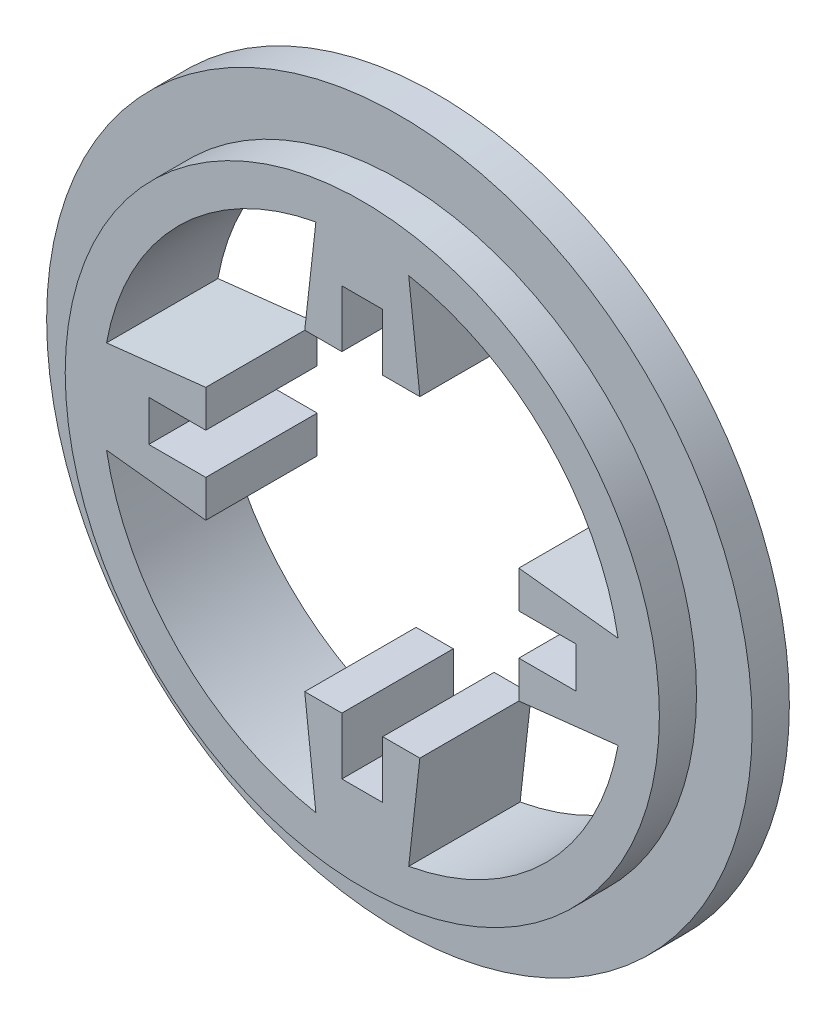
ISO-10303-21;
HEADER;
FILE_DESCRIPTION(('STEP AP214'),'2;1');
FILE_NAME('part.step','',(''),(''),'','','');
FILE_SCHEMA(('AUTOMOTIVE_DESIGN { 1 0 10303 214 1 1 1 1 }'));
ENDSEC;
DATA;
#1=APPLICATION_CONTEXT('core data for automotive mechanical design processes');
#2=APPLICATION_PROTOCOL_DEFINITION('international standard','automotive_design',2000,#1);
#3=PRODUCT_CONTEXT('',#1,'mechanical');
#4=PRODUCT('Part','Part','',(#3));
#5=PRODUCT_RELATED_PRODUCT_CATEGORY('part','',(#4));
#6=PRODUCT_DEFINITION_FORMATION('','',#4);
#7=PRODUCT_DEFINITION_CONTEXT('part definition',#1,'design');
#8=PRODUCT_DEFINITION('design','',#6,#7);
#9=PRODUCT_DEFINITION_SHAPE('','',#8);
#10=(LENGTH_UNIT() NAMED_UNIT(*) SI_UNIT(.MILLI.,.METRE.));
#11=(NAMED_UNIT(*) PLANE_ANGLE_UNIT() SI_UNIT($,.RADIAN.));
#12=(NAMED_UNIT(*) SI_UNIT($,.STERADIAN.) SOLID_ANGLE_UNIT());
#13=UNCERTAINTY_MEASURE_WITH_UNIT(LENGTH_MEASURE(1.E-05),#10,'distance_accuracy_value','');
#14=(GEOMETRIC_REPRESENTATION_CONTEXT(3) GLOBAL_UNCERTAINTY_ASSIGNED_CONTEXT((#13)) GLOBAL_UNIT_ASSIGNED_CONTEXT((#10,
#11,#12)) REPRESENTATION_CONTEXT('',''));
#15=CARTESIAN_POINT('',(0.,0.,0.));
#16=DIRECTION('',(0.,0.,1.));
#17=DIRECTION('',(1.,0.,0.));
#18=AXIS2_PLACEMENT_3D('',#15,#16,#17);
#19=CARTESIAN_POINT('',(-2.5,13.7749773139559,4.));
#20=DIRECTION('',(0.993761759972197,-0.111523828919929,0.));
#21=DIRECTION('',(0.111523828919929,0.993761759972197,0.));
#22=AXIS2_PLACEMENT_3D('',#19,#20,#21);
#23=PLANE('',#22);
#24=DIRECTION('',(-0.111523828919929,-0.993761759972197,0.));
#25=VECTOR('',#24,1.);
#26=CARTESIAN_POINT('',(-2.5,13.7749773139559,-2.));
#27=LINE('',#26,#25);
#28=CARTESIAN_POINT('',(-2.5,13.7749773139559,-2.));
#29=VERTEX_POINT('',#28);
#30=CARTESIAN_POINT('',(-3.1,8.42852300228219,-2.));
#31=VERTEX_POINT('',#30);
#32=EDGE_CURVE('E137',#29,#31,#27,.T.);
#33=ORIENTED_EDGE('',*,*,#32,.T.);
#34=DIRECTION('',(0.,0.,-1.));
#35=VECTOR('',#34,1.);
#36=CARTESIAN_POINT('',(-3.1,8.42852300228219,4.));
#37=LINE('',#36,#35);
#38=CARTESIAN_POINT('',(-3.1,8.42852300228219,4.));
#39=VERTEX_POINT('',#38);
#40=EDGE_CURVE('E51',#39,#31,#37,.T.);
#41=ORIENTED_EDGE('',*,*,#40,.F.);
#42=DIRECTION('',(-0.111523828919929,-0.993761759972197,0.));
#43=VECTOR('',#42,1.);
#44=CARTESIAN_POINT('',(-2.5,13.7749773139559,4.));
#45=LINE('',#44,#43);
#46=CARTESIAN_POINT('',(-2.5,13.7749773139559,4.));
#47=VERTEX_POINT('',#46);
#48=EDGE_CURVE('E101',#47,#39,#45,.T.);
#49=ORIENTED_EDGE('',*,*,#48,.F.);
#50=DIRECTION('',(0.,0.,-1.));
#51=VECTOR('',#50,1.);
#52=CARTESIAN_POINT('',(-2.5,13.7749773139559,4.));
#53=LINE('',#52,#51);
#54=EDGE_CURVE('E11',#47,#29,#53,.T.);
#55=ORIENTED_EDGE('',*,*,#54,.T.);
#56=EDGE_LOOP('',(#33,#41,#49,#55));
#57=FACE_BOUND('',#56,.T.);
#58=ADVANCED_FACE('F43',(#57),#23,.F.);
#59=CARTESIAN_POINT('',(-3.1,8.42852300228219,4.));
#60=DIRECTION('',(0.,1.,0.));
#61=DIRECTION('',(0.,0.,1.));
#62=AXIS2_PLACEMENT_3D('',#59,#60,#61);
#63=PLANE('',#62);
#64=DIRECTION('',(1.,0.,0.));
#65=VECTOR('',#64,1.);
#66=CARTESIAN_POINT('',(-3.1,8.42852300228219,-2.));
#67=LINE('',#66,#65);
#68=CARTESIAN_POINT('',(-1.1,8.42852300228219,-2.));
#69=VERTEX_POINT('',#68);
#70=EDGE_CURVE('E139',#31,#69,#67,.T.);
#71=ORIENTED_EDGE('',*,*,#70,.T.);
#72=DIRECTION('',(0.,0.,-1.));
#73=VECTOR('',#72,1.);
#74=CARTESIAN_POINT('',(-1.1,8.42852300228219,4.));
#75=LINE('',#74,#73);
#76=CARTESIAN_POINT('',(-1.1,8.42852300228219,4.));
#77=VERTEX_POINT('',#76);
#78=EDGE_CURVE('E158',#77,#69,#75,.T.);
#79=ORIENTED_EDGE('',*,*,#78,.F.);
#80=DIRECTION('',(1.,0.,0.));
#81=VECTOR('',#80,1.);
#82=CARTESIAN_POINT('',(-3.1,8.42852300228219,4.));
#83=LINE('',#82,#81);
#84=EDGE_CURVE('E166',#39,#77,#83,.T.);
#85=ORIENTED_EDGE('',*,*,#84,.F.);
#86=ORIENTED_EDGE('',*,*,#40,.T.);
#87=EDGE_LOOP('',(#71,#79,#85,#86));
#88=FACE_BOUND('',#87,.T.);
#89=ADVANCED_FACE('F164',(#88),#63,.F.);
#90=CARTESIAN_POINT('',(-1.1,8.42852300228219,4.));
#91=DIRECTION('',(-1.,0.,0.));
#92=DIRECTION('',(0.,-1.,0.));
#93=AXIS2_PLACEMENT_3D('',#90,#91,#92);
#94=PLANE('',#93);
#95=DIRECTION('',(0.,1.,0.));
#96=VECTOR('',#95,1.);
#97=CARTESIAN_POINT('',(-1.1,8.42852300228219,-2.));
#98=LINE('',#97,#96);
#99=CARTESIAN_POINT('',(-1.1,11.5,-2.));
#100=VERTEX_POINT('',#99);
#101=EDGE_CURVE('E142',#69,#100,#98,.T.);
#102=ORIENTED_EDGE('',*,*,#101,.T.);
#103=DIRECTION('',(0.,0.,-1.));
#104=VECTOR('',#103,1.);
#105=CARTESIAN_POINT('',(-1.1,11.5,4.));
#106=LINE('',#105,#104);
#107=CARTESIAN_POINT('',(-1.1,11.5,4.));
#108=VERTEX_POINT('',#107);
#109=EDGE_CURVE('E155',#108,#100,#106,.T.);
#110=ORIENTED_EDGE('',*,*,#109,.F.);
#111=DIRECTION('',(0.,1.,0.));
#112=VECTOR('',#111,1.);
#113=CARTESIAN_POINT('',(-1.1,8.42852300228219,4.));
#114=LINE('',#113,#112);
#115=EDGE_CURVE('E179',#77,#108,#114,.T.);
#116=ORIENTED_EDGE('',*,*,#115,.F.);
#117=ORIENTED_EDGE('',*,*,#78,.T.);
#118=EDGE_LOOP('',(#102,#110,#116,#117));
#119=FACE_BOUND('',#118,.T.);
#120=ADVANCED_FACE('F175',(#119),#94,.F.);
#121=CARTESIAN_POINT('',(-1.1,11.5,4.));
#122=DIRECTION('',(0.,1.,0.));
#123=DIRECTION('',(0.,0.,1.));
#124=AXIS2_PLACEMENT_3D('',#121,#122,#123);
#125=PLANE('',#124);
#126=DIRECTION('',(1.,0.,0.));
#127=VECTOR('',#126,1.);
#128=CARTESIAN_POINT('',(-1.1,11.5,-2.));
#129=LINE('',#128,#127);
#130=CARTESIAN_POINT('',(1.1,11.5,-2.));
#131=VERTEX_POINT('',#130);
#132=EDGE_CURVE('E144',#100,#131,#129,.T.);
#133=ORIENTED_EDGE('',*,*,#132,.T.);
#134=DIRECTION('',(0.,0.,-1.));
#135=VECTOR('',#134,1.);
#136=CARTESIAN_POINT('',(1.1,11.5,4.));
#137=LINE('',#136,#135);
#138=CARTESIAN_POINT('',(1.1,11.5,4.));
#139=VERTEX_POINT('',#138);
#140=EDGE_CURVE('E128',#139,#131,#137,.T.);
#141=ORIENTED_EDGE('',*,*,#140,.F.);
#142=DIRECTION('',(1.,0.,0.));
#143=VECTOR('',#142,1.);
#144=CARTESIAN_POINT('',(-1.1,11.5,4.));
#145=LINE('',#144,#143);
#146=EDGE_CURVE('E123',#108,#139,#145,.T.);
#147=ORIENTED_EDGE('',*,*,#146,.F.);
#148=ORIENTED_EDGE('',*,*,#109,.T.);
#149=EDGE_LOOP('',(#133,#141,#147,#148));
#150=FACE_BOUND('',#149,.T.);
#151=ADVANCED_FACE('F178',(#150),#125,.F.);
#152=CARTESIAN_POINT('',(1.1,8.42852300228219,4.));
#153=DIRECTION('',(1.,0.,0.));
#154=DIRECTION('',(0.,1.,0.));
#155=AXIS2_PLACEMENT_3D('',#152,#153,#154);
#156=PLANE('',#155);
#157=DIRECTION('',(0.,-1.,0.));
#158=VECTOR('',#157,1.);
#159=CARTESIAN_POINT('',(1.1,8.42852300228219,-2.));
#160=LINE('',#159,#158);
#161=CARTESIAN_POINT('',(1.1,8.42852300228219,-2.));
#162=VERTEX_POINT('',#161);
#163=EDGE_CURVE('E86',#131,#162,#160,.T.);
#164=ORIENTED_EDGE('',*,*,#163,.T.);
#165=DIRECTION('',(0.,0.,-1.));
#166=VECTOR('',#165,1.);
#167=CARTESIAN_POINT('',(1.1,8.42852300228219,4.));
#168=LINE('',#167,#166);
#169=CARTESIAN_POINT('',(1.1,8.42852300228219,4.));
#170=VERTEX_POINT('',#169);
#171=EDGE_CURVE('E126',#170,#162,#168,.T.);
#172=ORIENTED_EDGE('',*,*,#171,.F.);
#173=DIRECTION('',(0.,-1.,0.));
#174=VECTOR('',#173,1.);
#175=CARTESIAN_POINT('',(1.1,8.42852300228219,4.));
#176=LINE('',#175,#174);
#177=EDGE_CURVE('E117',#139,#170,#176,.T.);
#178=ORIENTED_EDGE('',*,*,#177,.F.);
#179=ORIENTED_EDGE('',*,*,#140,.T.);
#180=EDGE_LOOP('',(#164,#172,#178,#179));
#181=FACE_BOUND('',#180,.T.);
#182=ADVANCED_FACE('F127',(#181),#156,.F.);
#183=CARTESIAN_POINT('',(3.1,8.42852300228219,4.));
#184=DIRECTION('',(0.,1.,0.));
#185=DIRECTION('',(0.,0.,1.));
#186=AXIS2_PLACEMENT_3D('',#183,#184,#185);
#187=PLANE('',#186);
#188=DIRECTION('',(1.,0.,0.));
#189=VECTOR('',#188,1.);
#190=CARTESIAN_POINT('',(3.1,8.42852300228219,-2.));
#191=LINE('',#190,#189);
#192=CARTESIAN_POINT('',(3.1,8.42852300228219,-2.));
#193=VERTEX_POINT('',#192);
#194=EDGE_CURVE('E93',#162,#193,#191,.T.);
#195=ORIENTED_EDGE('',*,*,#194,.T.);
#196=DIRECTION('',(0.,0.,-1.));
#197=VECTOR('',#196,1.);
#198=CARTESIAN_POINT('',(3.1,8.42852300228219,4.));
#199=LINE('',#198,#197);
#200=CARTESIAN_POINT('',(3.1,8.42852300228219,4.));
#201=VERTEX_POINT('',#200);
#202=EDGE_CURVE('E129',#201,#193,#199,.T.);
#203=ORIENTED_EDGE('',*,*,#202,.F.);
#204=DIRECTION('',(1.,0.,0.));
#205=VECTOR('',#204,1.);
#206=CARTESIAN_POINT('',(3.1,8.42852300228219,4.));
#207=LINE('',#206,#205);
#208=EDGE_CURVE('E121',#170,#201,#207,.T.);
#209=ORIENTED_EDGE('',*,*,#208,.F.);
#210=ORIENTED_EDGE('',*,*,#171,.T.);
#211=EDGE_LOOP('',(#195,#203,#209,#210));
#212=FACE_BOUND('',#211,.T.);
#213=ADVANCED_FACE('F131',(#212),#187,.F.);
#214=CARTESIAN_POINT('',(2.5,13.7749773139559,4.));
#215=DIRECTION('',(-0.993761759972197,-0.111523828919929,0.));
#216=DIRECTION('',(0.111523828919929,-0.993761759972197,0.));
#217=AXIS2_PLACEMENT_3D('',#214,#215,#216);
#218=PLANE('',#217);
#219=DIRECTION('',(-0.111523828919929,0.993761759972197,0.));
#220=VECTOR('',#219,1.);
#221=CARTESIAN_POINT('',(2.5,13.7749773139559,-2.));
#222=LINE('',#221,#220);
#223=CARTESIAN_POINT('',(2.5,13.7749773139559,-2.));
#224=VERTEX_POINT('',#223);
#225=EDGE_CURVE('E148',#193,#224,#222,.T.);
#226=ORIENTED_EDGE('',*,*,#225,.T.);
#227=DIRECTION('',(0.,0.,-1.));
#228=VECTOR('',#227,1.);
#229=CARTESIAN_POINT('',(2.5,13.7749773139559,4.));
#230=LINE('',#229,#228);
#231=CARTESIAN_POINT('',(2.5,13.7749773139559,4.));
#232=VERTEX_POINT('',#231);
#233=EDGE_CURVE('E133',#232,#224,#230,.T.);
#234=ORIENTED_EDGE('',*,*,#233,.F.);
#235=DIRECTION('',(-0.111523828919929,0.993761759972197,0.));
#236=VECTOR('',#235,1.);
#237=CARTESIAN_POINT('',(2.5,13.7749773139559,4.));
#238=LINE('',#237,#236);
#239=EDGE_CURVE('E59',#201,#232,#238,.T.);
#240=ORIENTED_EDGE('',*,*,#239,.F.);
#241=ORIENTED_EDGE('',*,*,#202,.T.);
#242=EDGE_LOOP('',(#226,#234,#240,#241));
#243=FACE_BOUND('',#242,.T.);
#244=ADVANCED_FACE('F624',(#243),#218,.F.);
#245=CARTESIAN_POINT('',(0.,-2.23779328401008E-13,4.));
#246=DIRECTION('',(0.,0.,-1.));
#247=DIRECTION('',(-1.,0.,0.));
#248=AXIS2_PLACEMENT_3D('',#245,#246,#247);
#249=PLANE('',#248);
#250=ORIENTED_EDGE('',*,*,#239,.T.);
#251=CARTESIAN_POINT('',(0.,0.,4.));
#252=DIRECTION('',(0.,0.,1.));
#253=DIRECTION('',(1.,0.,0.));
#254=AXIS2_PLACEMENT_3D('',#251,#252,#253);
#255=CIRCLE('',#254,14.);
#256=CARTESIAN_POINT('',(13.7749773139559,2.50000000000014,4.));
#257=VERTEX_POINT('',#256);
#258=EDGE_CURVE('E537',#257,#232,#255,.T.);
#259=ORIENTED_EDGE('',*,*,#258,.F.);
#260=DIRECTION('',(-0.993761759972198,0.111523828919919,0.));
#261=VECTOR('',#260,1.);
#262=CARTESIAN_POINT('',(13.7749773139559,2.50000000000014,4.));
#263=LINE('',#262,#261);
#264=CARTESIAN_POINT('',(8.42852300228216,3.10000000000009,4.));
#265=VERTEX_POINT('',#264);
#266=EDGE_CURVE('E211',#257,#265,#263,.T.);
#267=ORIENTED_EDGE('',*,*,#266,.T.);
#268=DIRECTION('',(0.,-1.,0.));
#269=VECTOR('',#268,1.);
#270=CARTESIAN_POINT('',(8.42852300228216,3.10000000000009,4.));
#271=LINE('',#270,#269);
#272=CARTESIAN_POINT('',(8.42852300228218,1.10000000000009,4.));
#273=VERTEX_POINT('',#272);
#274=EDGE_CURVE('E245',#265,#273,#271,.T.);
#275=ORIENTED_EDGE('',*,*,#274,.T.);
#276=DIRECTION('',(1.,0.,0.));
#277=VECTOR('',#276,1.);
#278=CARTESIAN_POINT('',(8.42852300228218,1.10000000000009,4.));
#279=LINE('',#278,#277);
#280=CARTESIAN_POINT('',(11.5,1.10000000000012,4.));
#281=VERTEX_POINT('',#280);
#282=EDGE_CURVE('E242',#273,#281,#279,.T.);
#283=ORIENTED_EDGE('',*,*,#282,.T.);
#284=DIRECTION('',(0.,-1.,0.));
#285=VECTOR('',#284,1.);
#286=CARTESIAN_POINT('',(11.5,1.10000000000012,4.));
#287=LINE('',#286,#285);
#288=CARTESIAN_POINT('',(11.5,-1.09999999999988,4.));
#289=VERTEX_POINT('',#288);
#290=EDGE_CURVE('E239',#281,#289,#287,.T.);
#291=ORIENTED_EDGE('',*,*,#290,.T.);
#292=DIRECTION('',(-1.,0.,0.));
#293=VECTOR('',#292,1.);
#294=CARTESIAN_POINT('',(8.4285230022822,-1.09999999999991,4.));
#295=LINE('',#294,#293);
#296=CARTESIAN_POINT('',(8.4285230022822,-1.09999999999991,4.));
#297=VERTEX_POINT('',#296);
#298=EDGE_CURVE('E236',#289,#297,#295,.T.);
#299=ORIENTED_EDGE('',*,*,#298,.T.);
#300=DIRECTION('',(0.,-1.,0.));
#301=VECTOR('',#300,1.);
#302=CARTESIAN_POINT('',(8.42852300228222,-3.09999999999991,4.));
#303=LINE('',#302,#301);
#304=CARTESIAN_POINT('',(8.42852300228222,-3.09999999999991,4.));
#305=VERTEX_POINT('',#304);
#306=EDGE_CURVE('E233',#297,#305,#303,.T.);
#307=ORIENTED_EDGE('',*,*,#306,.T.);
#308=DIRECTION('',(0.993761759972196,0.11152382891994,0.));
#309=VECTOR('',#308,1.);
#310=CARTESIAN_POINT('',(13.7749773139559,-2.49999999999986,4.));
#311=LINE('',#310,#309);
#312=CARTESIAN_POINT('',(13.7749773139559,-2.49999999999986,4.));
#313=VERTEX_POINT('',#312);
#314=EDGE_CURVE('E207',#305,#313,#311,.T.);
#315=ORIENTED_EDGE('',*,*,#314,.T.);
#316=CARTESIAN_POINT('',(2.5,-13.7749773139559,4.));
#317=VERTEX_POINT('',#316);
#318=EDGE_CURVE('E399',#317,#313,#255,.T.);
#319=ORIENTED_EDGE('',*,*,#318,.F.);
#320=DIRECTION('',(0.111523828919929,0.993761759972197,0.));
#321=VECTOR('',#320,1.);
#322=CARTESIAN_POINT('',(2.5,-13.7749773139559,4.));
#323=LINE('',#322,#321);
#324=CARTESIAN_POINT('',(3.1,-8.42852300228219,4.));
#325=VERTEX_POINT('',#324);
#326=EDGE_CURVE('E277',#317,#325,#323,.T.);
#327=ORIENTED_EDGE('',*,*,#326,.T.);
#328=DIRECTION('',(-1.,0.,0.));
#329=VECTOR('',#328,1.);
#330=CARTESIAN_POINT('',(3.1,-8.42852300228219,4.));
#331=LINE('',#330,#329);
#332=CARTESIAN_POINT('',(1.1,-8.42852300228219,4.));
#333=VERTEX_POINT('',#332);
#334=EDGE_CURVE('E311',#325,#333,#331,.T.);
#335=ORIENTED_EDGE('',*,*,#334,.T.);
#336=DIRECTION('',(0.,-1.,0.));
#337=VECTOR('',#336,1.);
#338=CARTESIAN_POINT('',(1.1,-8.42852300228219,4.));
#339=LINE('',#338,#337);
#340=CARTESIAN_POINT('',(1.1,-11.5,4.));
#341=VERTEX_POINT('',#340);
#342=EDGE_CURVE('E308',#333,#341,#339,.T.);
#343=ORIENTED_EDGE('',*,*,#342,.T.);
#344=DIRECTION('',(-1.,0.,0.));
#345=VECTOR('',#344,1.);
#346=CARTESIAN_POINT('',(1.1,-11.5,4.));
#347=LINE('',#346,#345);
#348=CARTESIAN_POINT('',(-1.1,-11.5,4.));
#349=VERTEX_POINT('',#348);
#350=EDGE_CURVE('E305',#341,#349,#347,.T.);
#351=ORIENTED_EDGE('',*,*,#350,.T.);
#352=DIRECTION('',(0.,1.,0.));
#353=VECTOR('',#352,1.);
#354=CARTESIAN_POINT('',(-1.1,-8.42852300228219,4.));
#355=LINE('',#354,#353);
#356=CARTESIAN_POINT('',(-1.1,-8.42852300228219,4.));
#357=VERTEX_POINT('',#356);
#358=EDGE_CURVE('E302',#349,#357,#355,.T.);
#359=ORIENTED_EDGE('',*,*,#358,.T.);
#360=DIRECTION('',(-1.,0.,0.));
#361=VECTOR('',#360,1.);
#362=CARTESIAN_POINT('',(-3.1,-8.42852300228219,4.));
#363=LINE('',#362,#361);
#364=CARTESIAN_POINT('',(-3.1,-8.42852300228219,4.));
#365=VERTEX_POINT('',#364);
#366=EDGE_CURVE('E299',#357,#365,#363,.T.);
#367=ORIENTED_EDGE('',*,*,#366,.T.);
#368=DIRECTION('',(0.111523828919929,-0.993761759972197,0.));
#369=VECTOR('',#368,1.);
#370=CARTESIAN_POINT('',(-2.5,-13.7749773139559,4.));
#371=LINE('',#370,#369);
#372=CARTESIAN_POINT('',(-2.5,-13.7749773139559,4.));
#373=VERTEX_POINT('',#372);
#374=EDGE_CURVE('E273',#365,#373,#371,.T.);
#375=ORIENTED_EDGE('',*,*,#374,.T.);
#376=CARTESIAN_POINT('',(-13.7749773139559,-2.50000000000005,4.));
#377=VERTEX_POINT('',#376);
#378=EDGE_CURVE('E394',#377,#373,#255,.T.);
#379=ORIENTED_EDGE('',*,*,#378,.F.);
#380=DIRECTION('',(0.993761759972197,-0.111523828919926,0.));
#381=VECTOR('',#380,1.);
#382=CARTESIAN_POINT('',(-13.7749773139559,-2.50000000000005,4.));
#383=LINE('',#382,#381);
#384=CARTESIAN_POINT('',(-8.42852300228218,-3.10000000000003,4.));
#385=VERTEX_POINT('',#384);
#386=EDGE_CURVE('E343',#377,#385,#383,.T.);
#387=ORIENTED_EDGE('',*,*,#386,.T.);
#388=DIRECTION('',(0.,1.,0.));
#389=VECTOR('',#388,1.);
#390=CARTESIAN_POINT('',(-8.42852300228218,-3.10000000000003,4.));
#391=LINE('',#390,#389);
#392=CARTESIAN_POINT('',(-8.42852300228219,-1.10000000000003,4.));
#393=VERTEX_POINT('',#392);
#394=EDGE_CURVE('E377',#385,#393,#391,.T.);
#395=ORIENTED_EDGE('',*,*,#394,.T.);
#396=DIRECTION('',(-1.,0.,0.));
#397=VECTOR('',#396,1.);
#398=CARTESIAN_POINT('',(-8.42852300228219,-1.10000000000003,4.));
#399=LINE('',#398,#397);
#400=CARTESIAN_POINT('',(-11.5,-1.10000000000004,4.));
#401=VERTEX_POINT('',#400);
#402=EDGE_CURVE('E374',#393,#401,#399,.T.);
#403=ORIENTED_EDGE('',*,*,#402,.T.);
#404=DIRECTION('',(0.,1.,0.));
#405=VECTOR('',#404,1.);
#406=CARTESIAN_POINT('',(-11.5,-1.10000000000004,4.));
#407=LINE('',#406,#405);
#408=CARTESIAN_POINT('',(-11.5,1.09999999999996,4.));
#409=VERTEX_POINT('',#408);
#410=EDGE_CURVE('E371',#401,#409,#407,.T.);
#411=ORIENTED_EDGE('',*,*,#410,.T.);
#412=DIRECTION('',(1.,0.,0.));
#413=VECTOR('',#412,1.);
#414=CARTESIAN_POINT('',(-8.4285230022822,1.09999999999997,4.));
#415=LINE('',#414,#413);
#416=CARTESIAN_POINT('',(-8.4285230022822,1.09999999999997,4.));
#417=VERTEX_POINT('',#416);
#418=EDGE_CURVE('E368',#409,#417,#415,.T.);
#419=ORIENTED_EDGE('',*,*,#418,.T.);
#420=DIRECTION('',(0.,1.,0.));
#421=VECTOR('',#420,1.);
#422=CARTESIAN_POINT('',(-8.4285230022822,3.09999999999997,4.));
#423=LINE('',#422,#421);
#424=CARTESIAN_POINT('',(-8.4285230022822,3.09999999999997,4.));
#425=VERTEX_POINT('',#424);
#426=EDGE_CURVE('E365',#417,#425,#423,.T.);
#427=ORIENTED_EDGE('',*,*,#426,.T.);
#428=DIRECTION('',(-0.993761759972197,-0.111523828919933,0.));
#429=VECTOR('',#428,1.);
#430=CARTESIAN_POINT('',(-13.7749773139559,2.49999999999995,4.));
#431=LINE('',#430,#429);
#432=CARTESIAN_POINT('',(-13.7749773139559,2.49999999999995,4.));
#433=VERTEX_POINT('',#432);
#434=EDGE_CURVE('E339',#425,#433,#431,.T.);
#435=ORIENTED_EDGE('',*,*,#434,.T.);
#436=EDGE_CURVE('E400',#47,#433,#255,.T.);
#437=ORIENTED_EDGE('',*,*,#436,.F.);
#438=ORIENTED_EDGE('',*,*,#48,.T.);
#439=ORIENTED_EDGE('',*,*,#84,.T.);
#440=ORIENTED_EDGE('',*,*,#115,.T.);
#441=ORIENTED_EDGE('',*,*,#146,.T.);
#442=ORIENTED_EDGE('',*,*,#177,.T.);
#443=ORIENTED_EDGE('',*,*,#208,.T.);
#444=EDGE_LOOP('',(#250,#259,#267,#275,#283,#291,#299,#307,#315,#319,#327,#335,#343,#351,#359,
#367,#375,#379,#387,#395,#403,#411,#419,#427,#435,#437,#438,#439,#440,#441,#442,#443));
#445=FACE_BOUND('',#444,.T.);
#446=CARTESIAN_POINT('',(0.,0.,4.));
#447=DIRECTION('',(0.,0.,1.));
#448=DIRECTION('',(1.,0.,0.));
#449=AXIS2_PLACEMENT_3D('',#446,#447,#448);
#450=CIRCLE('',#449,16.);
#451=CARTESIAN_POINT('',(16.,0.,4.));
#452=VERTEX_POINT('',#451);
#453=EDGE_CURVE('E388',#452,#452,#450,.T.);
#454=ORIENTED_EDGE('',*,*,#453,.T.);
#455=EDGE_LOOP('',(#454));
#456=FACE_BOUND('',#455,.T.);
#457=ADVANCED_FACE('F118',(#445,#456),#249,.F.);
#458=CARTESIAN_POINT('',(0.,-2.23779328401008E-13,-2.));
#459=DIRECTION('',(0.,0.,-1.));
#460=DIRECTION('',(-1.,0.,0.));
#461=AXIS2_PLACEMENT_3D('',#458,#459,#460);
#462=PLANE('',#461);
#463=ORIENTED_EDGE('',*,*,#32,.F.);
#464=CARTESIAN_POINT('',(0.,0.,-2.));
#465=DIRECTION('',(0.,0.,-1.));
#466=DIRECTION('',(-1.,0.,0.));
#467=AXIS2_PLACEMENT_3D('',#464,#465,#466);
#468=CIRCLE('',#467,14.);
#469=CARTESIAN_POINT('',(-13.7749773139559,2.49999999999995,-2.));
#470=VERTEX_POINT('',#469);
#471=EDGE_CURVE('E404',#470,#29,#468,.T.);
#472=ORIENTED_EDGE('',*,*,#471,.F.);
#473=DIRECTION('',(-0.993761759972197,-0.111523828919933,0.));
#474=VECTOR('',#473,1.);
#475=CARTESIAN_POINT('',(-13.7749773139559,2.49999999999995,-2.));
#476=LINE('',#475,#474);
#477=CARTESIAN_POINT('',(-8.4285230022822,3.09999999999997,-2.));
#478=VERTEX_POINT('',#477);
#479=EDGE_CURVE('E340',#478,#470,#476,.T.);
#480=ORIENTED_EDGE('',*,*,#479,.F.);
#481=DIRECTION('',(0.,1.,0.));
#482=VECTOR('',#481,1.);
#483=CARTESIAN_POINT('',(-8.4285230022822,3.09999999999997,-2.));
#484=LINE('',#483,#482);
#485=CARTESIAN_POINT('',(-8.4285230022822,1.09999999999997,-2.));
#486=VERTEX_POINT('',#485);
#487=EDGE_CURVE('E344',#486,#478,#484,.T.);
#488=ORIENTED_EDGE('',*,*,#487,.F.);
#489=DIRECTION('',(1.,0.,0.));
#490=VECTOR('',#489,1.);
#491=CARTESIAN_POINT('',(-8.4285230022822,1.09999999999997,-2.));
#492=LINE('',#491,#490);
#493=CARTESIAN_POINT('',(-11.5,1.09999999999996,-2.));
#494=VERTEX_POINT('',#493);
#495=EDGE_CURVE('E347',#494,#486,#492,.T.);
#496=ORIENTED_EDGE('',*,*,#495,.F.);
#497=DIRECTION('',(0.,1.,0.));
#498=VECTOR('',#497,1.);
#499=CARTESIAN_POINT('',(-11.5,-1.10000000000004,-2.));
#500=LINE('',#499,#498);
#501=CARTESIAN_POINT('',(-11.5,-1.10000000000004,-2.));
#502=VERTEX_POINT('',#501);
#503=EDGE_CURVE('E350',#502,#494,#500,.T.);
#504=ORIENTED_EDGE('',*,*,#503,.F.);
#505=DIRECTION('',(-1.,0.,0.));
#506=VECTOR('',#505,1.);
#507=CARTESIAN_POINT('',(-8.42852300228219,-1.10000000000003,-2.));
#508=LINE('',#507,#506);
#509=CARTESIAN_POINT('',(-8.42852300228219,-1.10000000000003,-2.));
#510=VERTEX_POINT('',#509);
#511=EDGE_CURVE('E353',#510,#502,#508,.T.);
#512=ORIENTED_EDGE('',*,*,#511,.F.);
#513=DIRECTION('',(0.,1.,0.));
#514=VECTOR('',#513,1.);
#515=CARTESIAN_POINT('',(-8.42852300228218,-3.10000000000003,-2.));
#516=LINE('',#515,#514);
#517=CARTESIAN_POINT('',(-8.42852300228218,-3.10000000000003,-2.));
#518=VERTEX_POINT('',#517);
#519=EDGE_CURVE('E356',#518,#510,#516,.T.);
#520=ORIENTED_EDGE('',*,*,#519,.F.);
#521=DIRECTION('',(0.993761759972197,-0.111523828919926,0.));
#522=VECTOR('',#521,1.);
#523=CARTESIAN_POINT('',(-13.7749773139559,-2.50000000000005,-2.));
#524=LINE('',#523,#522);
#525=CARTESIAN_POINT('',(-13.7749773139559,-2.50000000000005,-2.));
#526=VERTEX_POINT('',#525);
#527=EDGE_CURVE('E359',#526,#518,#524,.T.);
#528=ORIENTED_EDGE('',*,*,#527,.F.);
#529=CARTESIAN_POINT('',(-2.5,-13.7749773139559,-2.));
#530=VERTEX_POINT('',#529);
#531=EDGE_CURVE('E407',#530,#526,#468,.T.);
#532=ORIENTED_EDGE('',*,*,#531,.F.);
#533=DIRECTION('',(0.111523828919929,-0.993761759972197,0.));
#534=VECTOR('',#533,1.);
#535=CARTESIAN_POINT('',(-2.5,-13.7749773139559,-2.));
#536=LINE('',#535,#534);
#537=CARTESIAN_POINT('',(-3.1,-8.42852300228219,-2.));
#538=VERTEX_POINT('',#537);
#539=EDGE_CURVE('E274',#538,#530,#536,.T.);
#540=ORIENTED_EDGE('',*,*,#539,.F.);
#541=DIRECTION('',(-1.,0.,0.));
#542=VECTOR('',#541,1.);
#543=CARTESIAN_POINT('',(-3.1,-8.42852300228219,-2.));
#544=LINE('',#543,#542);
#545=CARTESIAN_POINT('',(-1.1,-8.42852300228219,-2.));
#546=VERTEX_POINT('',#545);
#547=EDGE_CURVE('E278',#546,#538,#544,.T.);
#548=ORIENTED_EDGE('',*,*,#547,.F.);
#549=DIRECTION('',(0.,1.,0.));
#550=VECTOR('',#549,1.);
#551=CARTESIAN_POINT('',(-1.1,-8.42852300228219,-2.));
#552=LINE('',#551,#550);
#553=CARTESIAN_POINT('',(-1.1,-11.5,-2.));
#554=VERTEX_POINT('',#553);
#555=EDGE_CURVE('E281',#554,#546,#552,.T.);
#556=ORIENTED_EDGE('',*,*,#555,.F.);
#557=DIRECTION('',(-1.,0.,0.));
#558=VECTOR('',#557,1.);
#559=CARTESIAN_POINT('',(1.1,-11.5,-2.));
#560=LINE('',#559,#558);
#561=CARTESIAN_POINT('',(1.1,-11.5,-2.));
#562=VERTEX_POINT('',#561);
#563=EDGE_CURVE('E284',#562,#554,#560,.T.);
#564=ORIENTED_EDGE('',*,*,#563,.F.);
#565=DIRECTION('',(0.,-1.,0.));
#566=VECTOR('',#565,1.);
#567=CARTESIAN_POINT('',(1.1,-8.42852300228219,-2.));
#568=LINE('',#567,#566);
#569=CARTESIAN_POINT('',(1.1,-8.42852300228219,-2.));
#570=VERTEX_POINT('',#569);
#571=EDGE_CURVE('E287',#570,#562,#568,.T.);
#572=ORIENTED_EDGE('',*,*,#571,.F.);
#573=DIRECTION('',(-1.,0.,0.));
#574=VECTOR('',#573,1.);
#575=CARTESIAN_POINT('',(3.1,-8.42852300228219,-2.));
#576=LINE('',#575,#574);
#577=CARTESIAN_POINT('',(3.1,-8.42852300228219,-2.));
#578=VERTEX_POINT('',#577);
#579=EDGE_CURVE('E290',#578,#570,#576,.T.);
#580=ORIENTED_EDGE('',*,*,#579,.F.);
#581=DIRECTION('',(0.111523828919929,0.993761759972197,0.));
#582=VECTOR('',#581,1.);
#583=CARTESIAN_POINT('',(2.5,-13.7749773139559,-2.));
#584=LINE('',#583,#582);
#585=CARTESIAN_POINT('',(2.5,-13.7749773139559,-2.));
#586=VERTEX_POINT('',#585);
#587=EDGE_CURVE('E293',#586,#578,#584,.T.);
#588=ORIENTED_EDGE('',*,*,#587,.F.);
#589=CARTESIAN_POINT('',(13.7749773139559,-2.49999999999986,-2.));
#590=VERTEX_POINT('',#589);
#591=EDGE_CURVE('E410',#590,#586,#468,.T.);
#592=ORIENTED_EDGE('',*,*,#591,.F.);
#593=DIRECTION('',(0.993761759972196,0.11152382891994,0.));
#594=VECTOR('',#593,1.);
#595=CARTESIAN_POINT('',(13.7749773139559,-2.49999999999986,-2.));
#596=LINE('',#595,#594);
#597=CARTESIAN_POINT('',(8.42852300228222,-3.09999999999991,-2.));
#598=VERTEX_POINT('',#597);
#599=EDGE_CURVE('E208',#598,#590,#596,.T.);
#600=ORIENTED_EDGE('',*,*,#599,.F.);
#601=DIRECTION('',(0.,-1.,0.));
#602=VECTOR('',#601,1.);
#603=CARTESIAN_POINT('',(8.42852300228222,-3.09999999999991,-2.));
#604=LINE('',#603,#602);
#605=CARTESIAN_POINT('',(8.4285230022822,-1.09999999999991,-2.));
#606=VERTEX_POINT('',#605);
#607=EDGE_CURVE('E212',#606,#598,#604,.T.);
#608=ORIENTED_EDGE('',*,*,#607,.F.);
#609=DIRECTION('',(-1.,0.,0.));
#610=VECTOR('',#609,1.);
#611=CARTESIAN_POINT('',(8.4285230022822,-1.09999999999991,-2.));
#612=LINE('',#611,#610);
#613=CARTESIAN_POINT('',(11.5,-1.09999999999988,-2.));
#614=VERTEX_POINT('',#613);
#615=EDGE_CURVE('E215',#614,#606,#612,.T.);
#616=ORIENTED_EDGE('',*,*,#615,.F.);
#617=DIRECTION('',(0.,-1.,0.));
#618=VECTOR('',#617,1.);
#619=CARTESIAN_POINT('',(11.5,1.10000000000012,-2.));
#620=LINE('',#619,#618);
#621=CARTESIAN_POINT('',(11.5,1.10000000000012,-2.));
#622=VERTEX_POINT('',#621);
#623=EDGE_CURVE('E218',#622,#614,#620,.T.);
#624=ORIENTED_EDGE('',*,*,#623,.F.);
#625=DIRECTION('',(1.,0.,0.));
#626=VECTOR('',#625,1.);
#627=CARTESIAN_POINT('',(8.42852300228218,1.10000000000009,-2.));
#628=LINE('',#627,#626);
#629=CARTESIAN_POINT('',(8.42852300228218,1.10000000000009,-2.));
#630=VERTEX_POINT('',#629);
#631=EDGE_CURVE('E221',#630,#622,#628,.T.);
#632=ORIENTED_EDGE('',*,*,#631,.F.);
#633=DIRECTION('',(0.,-1.,0.));
#634=VECTOR('',#633,1.);
#635=CARTESIAN_POINT('',(8.42852300228216,3.10000000000009,-2.));
#636=LINE('',#635,#634);
#637=CARTESIAN_POINT('',(8.42852300228216,3.10000000000009,-2.));
#638=VERTEX_POINT('',#637);
#639=EDGE_CURVE('E224',#638,#630,#636,.T.);
#640=ORIENTED_EDGE('',*,*,#639,.F.);
#641=DIRECTION('',(-0.993761759972198,0.111523828919919,0.));
#642=VECTOR('',#641,1.);
#643=CARTESIAN_POINT('',(13.7749773139559,2.50000000000014,-2.));
#644=LINE('',#643,#642);
#645=CARTESIAN_POINT('',(13.7749773139559,2.50000000000014,-2.));
#646=VERTEX_POINT('',#645);
#647=EDGE_CURVE('E227',#646,#638,#644,.T.);
#648=ORIENTED_EDGE('',*,*,#647,.F.);
#649=EDGE_CURVE('E406',#224,#646,#468,.T.);
#650=ORIENTED_EDGE('',*,*,#649,.F.);
#651=ORIENTED_EDGE('',*,*,#225,.F.);
#652=ORIENTED_EDGE('',*,*,#194,.F.);
#653=ORIENTED_EDGE('',*,*,#163,.F.);
#654=ORIENTED_EDGE('',*,*,#132,.F.);
#655=ORIENTED_EDGE('',*,*,#101,.F.);
#656=ORIENTED_EDGE('',*,*,#70,.F.);
#657=EDGE_LOOP('',(#463,#472,#480,#488,#496,#504,#512,#520,#528,#532,#540,#548,#556,#564,#572,
#580,#588,#592,#600,#608,#616,#624,#632,#640,#648,#650,#651,#652,#653,#654,#655,#656));
#658=FACE_BOUND('',#657,.T.);
#659=CARTESIAN_POINT('',(0.,0.,-2.));
#660=DIRECTION('',(0.,0.,-1.));
#661=DIRECTION('',(-1.,0.,0.));
#662=AXIS2_PLACEMENT_3D('',#659,#660,#661);
#663=CIRCLE('',#662,16.);
#664=CARTESIAN_POINT('',(-16.,0.,-2.));
#665=VERTEX_POINT('',#664);
#666=EDGE_CURVE('E401',#665,#665,#663,.T.);
#667=ORIENTED_EDGE('',*,*,#666,.T.);
#668=EDGE_LOOP('',(#667));
#669=FACE_BOUND('',#668,.T.);
#670=ADVANCED_FACE('F169',(#658,#669),#462,.T.);
#671=CARTESIAN_POINT('',(0.,0.,2.));
#672=DIRECTION('',(0.,0.,-1.));
#673=DIRECTION('',(-1.,0.,0.));
#674=AXIS2_PLACEMENT_3D('',#671,#672,#673);
#675=CYLINDRICAL_SURFACE('',#674,14.);
#676=ORIENTED_EDGE('',*,*,#54,.F.);
#677=ORIENTED_EDGE('',*,*,#436,.T.);
#678=DIRECTION('',(0.,0.,-1.));
#679=VECTOR('',#678,1.);
#680=CARTESIAN_POINT('',(-13.7749773139559,2.49999999999995,4.));
#681=LINE('',#680,#679);
#682=EDGE_CURVE('E336',#433,#470,#681,.T.);
#683=ORIENTED_EDGE('',*,*,#682,.T.);
#684=ORIENTED_EDGE('',*,*,#471,.T.);
#685=EDGE_LOOP('',(#676,#677,#683,#684));
#686=FACE_BOUND('',#685,.T.);
#687=ADVANCED_FACE('F541',(#686),#675,.F.);
#688=CARTESIAN_POINT('',(13.7749773139559,2.50000000000014,4.));
#689=DIRECTION('',(-0.111523828919919,-0.993761759972198,0.));
#690=DIRECTION('',(0.993761759972198,-0.111523828919919,0.));
#691=AXIS2_PLACEMENT_3D('',#688,#689,#690);
#692=PLANE('',#691);
#693=ORIENTED_EDGE('',*,*,#647,.T.);
#694=DIRECTION('',(0.,0.,-1.));
#695=VECTOR('',#694,1.);
#696=CARTESIAN_POINT('',(8.42852300228216,3.10000000000009,4.));
#697=LINE('',#696,#695);
#698=EDGE_CURVE('E186',#265,#638,#697,.T.);
#699=ORIENTED_EDGE('',*,*,#698,.F.);
#700=ORIENTED_EDGE('',*,*,#266,.F.);
#701=DIRECTION('',(0.,0.,-1.));
#702=VECTOR('',#701,1.);
#703=CARTESIAN_POINT('',(13.7749773139559,2.50000000000014,4.));
#704=LINE('',#703,#702);
#705=EDGE_CURVE('E140',#257,#646,#704,.T.);
#706=ORIENTED_EDGE('',*,*,#705,.T.);
#707=EDGE_LOOP('',(#693,#699,#700,#706));
#708=FACE_BOUND('',#707,.T.);
#709=ADVANCED_FACE('F533',(#708),#692,.F.);
#710=CARTESIAN_POINT('',(8.42852300228216,3.10000000000009,4.));
#711=DIRECTION('',(1.,0.,0.));
#712=DIRECTION('',(0.,0.,1.));
#713=AXIS2_PLACEMENT_3D('',#710,#711,#712);
#714=PLANE('',#713);
#715=ORIENTED_EDGE('',*,*,#639,.T.);
#716=DIRECTION('',(0.,0.,-1.));
#717=VECTOR('',#716,1.);
#718=CARTESIAN_POINT('',(8.42852300228218,1.10000000000009,4.));
#719=LINE('',#718,#717);
#720=EDGE_CURVE('E189',#273,#630,#719,.T.);
#721=ORIENTED_EDGE('',*,*,#720,.F.);
#722=ORIENTED_EDGE('',*,*,#274,.F.);
#723=ORIENTED_EDGE('',*,*,#698,.T.);
#724=EDGE_LOOP('',(#715,#721,#722,#723));
#725=FACE_BOUND('',#724,.T.);
#726=ADVANCED_FACE('F526',(#725),#714,.F.);
#727=CARTESIAN_POINT('',(8.42852300228218,1.10000000000009,4.));
#728=DIRECTION('',(0.,1.,0.));
#729=DIRECTION('',(-1.,0.,0.));
#730=AXIS2_PLACEMENT_3D('',#727,#728,#729);
#731=PLANE('',#730);
#732=ORIENTED_EDGE('',*,*,#631,.T.);
#733=DIRECTION('',(0.,0.,-1.));
#734=VECTOR('',#733,1.);
#735=CARTESIAN_POINT('',(11.5,1.10000000000012,4.));
#736=LINE('',#735,#734);
#737=EDGE_CURVE('E192',#281,#622,#736,.T.);
#738=ORIENTED_EDGE('',*,*,#737,.F.);
#739=ORIENTED_EDGE('',*,*,#282,.F.);
#740=ORIENTED_EDGE('',*,*,#720,.T.);
#741=EDGE_LOOP('',(#732,#738,#739,#740));
#742=FACE_BOUND('',#741,.T.);
#743=ADVANCED_FACE('F522',(#742),#731,.F.);
#744=CARTESIAN_POINT('',(11.5,1.10000000000012,4.));
#745=DIRECTION('',(1.,0.,0.));
#746=DIRECTION('',(0.,0.,1.));
#747=AXIS2_PLACEMENT_3D('',#744,#745,#746);
#748=PLANE('',#747);
#749=ORIENTED_EDGE('',*,*,#623,.T.);
#750=DIRECTION('',(0.,0.,-1.));
#751=VECTOR('',#750,1.);
#752=CARTESIAN_POINT('',(11.5,-1.09999999999988,4.));
#753=LINE('',#752,#751);
#754=EDGE_CURVE('E195',#289,#614,#753,.T.);
#755=ORIENTED_EDGE('',*,*,#754,.F.);
#756=ORIENTED_EDGE('',*,*,#290,.F.);
#757=ORIENTED_EDGE('',*,*,#737,.T.);
#758=EDGE_LOOP('',(#749,#755,#756,#757));
#759=FACE_BOUND('',#758,.T.);
#760=ADVANCED_FACE('F518',(#759),#748,.F.);
#761=CARTESIAN_POINT('',(8.4285230022822,-1.09999999999991,4.));
#762=DIRECTION('',(0.,-1.,0.));
#763=DIRECTION('',(1.,0.,0.));
#764=AXIS2_PLACEMENT_3D('',#761,#762,#763);
#765=PLANE('',#764);
#766=ORIENTED_EDGE('',*,*,#615,.T.);
#767=DIRECTION('',(0.,0.,-1.));
#768=VECTOR('',#767,1.);
#769=CARTESIAN_POINT('',(8.4285230022822,-1.09999999999991,4.));
#770=LINE('',#769,#768);
#771=EDGE_CURVE('E198',#297,#606,#770,.T.);
#772=ORIENTED_EDGE('',*,*,#771,.F.);
#773=ORIENTED_EDGE('',*,*,#298,.F.);
#774=ORIENTED_EDGE('',*,*,#754,.T.);
#775=EDGE_LOOP('',(#766,#772,#773,#774));
#776=FACE_BOUND('',#775,.T.);
#777=ADVANCED_FACE('F513',(#776),#765,.F.);
#778=CARTESIAN_POINT('',(8.42852300228222,-3.09999999999991,4.));
#779=DIRECTION('',(1.,0.,0.));
#780=DIRECTION('',(0.,0.,1.));
#781=AXIS2_PLACEMENT_3D('',#778,#779,#780);
#782=PLANE('',#781);
#783=ORIENTED_EDGE('',*,*,#607,.T.);
#784=DIRECTION('',(0.,0.,-1.));
#785=VECTOR('',#784,1.);
#786=CARTESIAN_POINT('',(8.42852300228222,-3.09999999999991,4.));
#787=LINE('',#786,#785);
#788=EDGE_CURVE('E201',#305,#598,#787,.T.);
#789=ORIENTED_EDGE('',*,*,#788,.F.);
#790=ORIENTED_EDGE('',*,*,#306,.F.);
#791=ORIENTED_EDGE('',*,*,#771,.T.);
#792=EDGE_LOOP('',(#783,#789,#790,#791));
#793=FACE_BOUND('',#792,.T.);
#794=ADVANCED_FACE('F502',(#793),#782,.F.);
#795=CARTESIAN_POINT('',(13.7749773139559,-2.49999999999986,4.));
#796=DIRECTION('',(-0.11152382891994,0.993761759972196,0.));
#797=DIRECTION('',(-0.993761759972196,-0.11152382891994,0.));
#798=AXIS2_PLACEMENT_3D('',#795,#796,#797);
#799=PLANE('',#798);
#800=ORIENTED_EDGE('',*,*,#599,.T.);
#801=DIRECTION('',(0.,0.,-1.));
#802=VECTOR('',#801,1.);
#803=CARTESIAN_POINT('',(13.7749773139559,-2.49999999999986,4.));
#804=LINE('',#803,#802);
#805=EDGE_CURVE('E204',#313,#590,#804,.T.);
#806=ORIENTED_EDGE('',*,*,#805,.F.);
#807=ORIENTED_EDGE('',*,*,#314,.F.);
#808=ORIENTED_EDGE('',*,*,#788,.T.);
#809=EDGE_LOOP('',(#800,#806,#807,#808));
#810=FACE_BOUND('',#809,.T.);
#811=ADVANCED_FACE('F508',(#810),#799,.F.);
#812=ORIENTED_EDGE('',*,*,#258,.T.);
#813=ORIENTED_EDGE('',*,*,#233,.T.);
#814=ORIENTED_EDGE('',*,*,#649,.T.);
#815=ORIENTED_EDGE('',*,*,#705,.F.);
#816=EDGE_LOOP('',(#812,#813,#814,#815));
#817=FACE_BOUND('',#816,.T.);
#818=ADVANCED_FACE('F536',(#817),#675,.F.);
#819=CARTESIAN_POINT('',(2.5,-13.7749773139559,4.));
#820=DIRECTION('',(-0.993761759972197,0.111523828919929,0.));
#821=DIRECTION('',(-0.111523828919929,-0.993761759972197,0.));
#822=AXIS2_PLACEMENT_3D('',#819,#820,#821);
#823=PLANE('',#822);
#824=ORIENTED_EDGE('',*,*,#587,.T.);
#825=DIRECTION('',(0.,0.,-1.));
#826=VECTOR('',#825,1.);
#827=CARTESIAN_POINT('',(3.1,-8.42852300228219,4.));
#828=LINE('',#827,#826);
#829=EDGE_CURVE('E252',#325,#578,#828,.T.);
#830=ORIENTED_EDGE('',*,*,#829,.F.);
#831=ORIENTED_EDGE('',*,*,#326,.F.);
#832=DIRECTION('',(0.,0.,-1.));
#833=VECTOR('',#832,1.);
#834=CARTESIAN_POINT('',(2.5,-13.7749773139559,4.));
#835=LINE('',#834,#833);
#836=EDGE_CURVE('E230',#317,#586,#835,.T.);
#837=ORIENTED_EDGE('',*,*,#836,.T.);
#838=EDGE_LOOP('',(#824,#830,#831,#837));
#839=FACE_BOUND('',#838,.T.);
#840=ADVANCED_FACE('F438',(#839),#823,.F.);
#841=CARTESIAN_POINT('',(3.1,-8.42852300228219,4.));
#842=DIRECTION('',(0.,-1.,0.));
#843=DIRECTION('',(0.,0.,1.));
#844=AXIS2_PLACEMENT_3D('',#841,#842,#843);
#845=PLANE('',#844);
#846=ORIENTED_EDGE('',*,*,#579,.T.);
#847=DIRECTION('',(0.,0.,-1.));
#848=VECTOR('',#847,1.);
#849=CARTESIAN_POINT('',(1.1,-8.42852300228219,4.));
#850=LINE('',#849,#848);
#851=EDGE_CURVE('E255',#333,#570,#850,.T.);
#852=ORIENTED_EDGE('',*,*,#851,.F.);
#853=ORIENTED_EDGE('',*,*,#334,.F.);
#854=ORIENTED_EDGE('',*,*,#829,.T.);
#855=EDGE_LOOP('',(#846,#852,#853,#854));
#856=FACE_BOUND('',#855,.T.);
#857=ADVANCED_FACE('F600',(#856),#845,.F.);
#858=CARTESIAN_POINT('',(1.1,-8.42852300228219,4.));
#859=DIRECTION('',(1.,0.,0.));
#860=DIRECTION('',(0.,1.,0.));
#861=AXIS2_PLACEMENT_3D('',#858,#859,#860);
#862=PLANE('',#861);
#863=ORIENTED_EDGE('',*,*,#571,.T.);
#864=DIRECTION('',(0.,0.,-1.));
#865=VECTOR('',#864,1.);
#866=CARTESIAN_POINT('',(1.1,-11.5,4.));
#867=LINE('',#866,#865);
#868=EDGE_CURVE('E258',#341,#562,#867,.T.);
#869=ORIENTED_EDGE('',*,*,#868,.F.);
#870=ORIENTED_EDGE('',*,*,#342,.F.);
#871=ORIENTED_EDGE('',*,*,#851,.T.);
#872=EDGE_LOOP('',(#863,#869,#870,#871));
#873=FACE_BOUND('',#872,.T.);
#874=ADVANCED_FACE('F598',(#873),#862,.F.);
#875=CARTESIAN_POINT('',(1.1,-11.5,4.));
#876=DIRECTION('',(0.,-1.,0.));
#877=DIRECTION('',(0.,0.,1.));
#878=AXIS2_PLACEMENT_3D('',#875,#876,#877);
#879=PLANE('',#878);
#880=ORIENTED_EDGE('',*,*,#563,.T.);
#881=DIRECTION('',(0.,0.,-1.));
#882=VECTOR('',#881,1.);
#883=CARTESIAN_POINT('',(-1.1,-11.5,4.));
#884=LINE('',#883,#882);
#885=EDGE_CURVE('E261',#349,#554,#884,.T.);
#886=ORIENTED_EDGE('',*,*,#885,.F.);
#887=ORIENTED_EDGE('',*,*,#350,.F.);
#888=ORIENTED_EDGE('',*,*,#868,.T.);
#889=EDGE_LOOP('',(#880,#886,#887,#888));
#890=FACE_BOUND('',#889,.T.);
#891=ADVANCED_FACE('F594',(#890),#879,.F.);
#892=CARTESIAN_POINT('',(-1.1,-8.42852300228219,4.));
#893=DIRECTION('',(-1.,0.,0.));
#894=DIRECTION('',(0.,-1.,0.));
#895=AXIS2_PLACEMENT_3D('',#892,#893,#894);
#896=PLANE('',#895);
#897=ORIENTED_EDGE('',*,*,#555,.T.);
#898=DIRECTION('',(0.,0.,-1.));
#899=VECTOR('',#898,1.);
#900=CARTESIAN_POINT('',(-1.1,-8.42852300228219,4.));
#901=LINE('',#900,#899);
#902=EDGE_CURVE('E264',#357,#546,#901,.T.);
#903=ORIENTED_EDGE('',*,*,#902,.F.);
#904=ORIENTED_EDGE('',*,*,#358,.F.);
#905=ORIENTED_EDGE('',*,*,#885,.T.);
#906=EDGE_LOOP('',(#897,#903,#904,#905));
#907=FACE_BOUND('',#906,.T.);
#908=ADVANCED_FACE('F590',(#907),#896,.F.);
#909=CARTESIAN_POINT('',(-3.1,-8.42852300228219,4.));
#910=DIRECTION('',(0.,-1.,0.));
#911=DIRECTION('',(0.,0.,1.));
#912=AXIS2_PLACEMENT_3D('',#909,#910,#911);
#913=PLANE('',#912);
#914=ORIENTED_EDGE('',*,*,#547,.T.);
#915=DIRECTION('',(0.,0.,-1.));
#916=VECTOR('',#915,1.);
#917=CARTESIAN_POINT('',(-3.1,-8.42852300228219,4.));
#918=LINE('',#917,#916);
#919=EDGE_CURVE('E267',#365,#538,#918,.T.);
#920=ORIENTED_EDGE('',*,*,#919,.F.);
#921=ORIENTED_EDGE('',*,*,#366,.F.);
#922=ORIENTED_EDGE('',*,*,#902,.T.);
#923=EDGE_LOOP('',(#914,#920,#921,#922));
#924=FACE_BOUND('',#923,.T.);
#925=ADVANCED_FACE('F586',(#924),#913,.F.);
#926=CARTESIAN_POINT('',(-2.5,-13.7749773139559,4.));
#927=DIRECTION('',(0.993761759972197,0.111523828919929,0.));
#928=DIRECTION('',(-0.111523828919929,0.993761759972197,0.));
#929=AXIS2_PLACEMENT_3D('',#926,#927,#928);
#930=PLANE('',#929);
#931=ORIENTED_EDGE('',*,*,#539,.T.);
#932=DIRECTION('',(0.,0.,-1.));
#933=VECTOR('',#932,1.);
#934=CARTESIAN_POINT('',(-2.5,-13.7749773139559,4.));
#935=LINE('',#934,#933);
#936=EDGE_CURVE('E270',#373,#530,#935,.T.);
#937=ORIENTED_EDGE('',*,*,#936,.F.);
#938=ORIENTED_EDGE('',*,*,#374,.F.);
#939=ORIENTED_EDGE('',*,*,#919,.T.);
#940=EDGE_LOOP('',(#931,#937,#938,#939));
#941=FACE_BOUND('',#940,.T.);
#942=ADVANCED_FACE('F569',(#941),#930,.F.);
#943=ORIENTED_EDGE('',*,*,#318,.T.);
#944=ORIENTED_EDGE('',*,*,#805,.T.);
#945=ORIENTED_EDGE('',*,*,#591,.T.);
#946=ORIENTED_EDGE('',*,*,#836,.F.);
#947=EDGE_LOOP('',(#943,#944,#945,#946));
#948=FACE_BOUND('',#947,.T.);
#949=ADVANCED_FACE('F424',(#948),#675,.F.);
#950=CARTESIAN_POINT('',(-13.7749773139559,-2.50000000000005,4.));
#951=DIRECTION('',(0.111523828919926,0.993761759972197,0.));
#952=DIRECTION('',(-0.993761759972197,0.111523828919926,0.));
#953=AXIS2_PLACEMENT_3D('',#950,#951,#952);
#954=PLANE('',#953);
#955=ORIENTED_EDGE('',*,*,#527,.T.);
#956=DIRECTION('',(0.,0.,-1.));
#957=VECTOR('',#956,1.);
#958=CARTESIAN_POINT('',(-8.42852300228218,-3.10000000000003,4.));
#959=LINE('',#958,#957);
#960=EDGE_CURVE('E318',#385,#518,#959,.T.);
#961=ORIENTED_EDGE('',*,*,#960,.F.);
#962=ORIENTED_EDGE('',*,*,#386,.F.);
#963=DIRECTION('',(0.,0.,-1.));
#964=VECTOR('',#963,1.);
#965=CARTESIAN_POINT('',(-13.7749773139559,-2.50000000000005,4.));
#966=LINE('',#965,#964);
#967=EDGE_CURVE('E296',#377,#526,#966,.T.);
#968=ORIENTED_EDGE('',*,*,#967,.T.);
#969=EDGE_LOOP('',(#955,#961,#962,#968));
#970=FACE_BOUND('',#969,.T.);
#971=ADVANCED_FACE('F581',(#970),#954,.F.);
#972=CARTESIAN_POINT('',(-8.42852300228218,-3.10000000000003,4.));
#973=DIRECTION('',(-1.,0.,0.));
#974=DIRECTION('',(0.,0.,1.));
#975=AXIS2_PLACEMENT_3D('',#972,#973,#974);
#976=PLANE('',#975);
#977=ORIENTED_EDGE('',*,*,#519,.T.);
#978=DIRECTION('',(0.,0.,-1.));
#979=VECTOR('',#978,1.);
#980=CARTESIAN_POINT('',(-8.42852300228219,-1.10000000000003,4.));
#981=LINE('',#980,#979);
#982=EDGE_CURVE('E321',#393,#510,#981,.T.);
#983=ORIENTED_EDGE('',*,*,#982,.F.);
#984=ORIENTED_EDGE('',*,*,#394,.F.);
#985=ORIENTED_EDGE('',*,*,#960,.T.);
#986=EDGE_LOOP('',(#977,#983,#984,#985));
#987=FACE_BOUND('',#986,.T.);
#988=ADVANCED_FACE('F680',(#987),#976,.F.);
#989=CARTESIAN_POINT('',(-8.42852300228219,-1.10000000000003,4.));
#990=DIRECTION('',(0.,-1.,0.));
#991=DIRECTION('',(1.,0.,0.));
#992=AXIS2_PLACEMENT_3D('',#989,#990,#991);
#993=PLANE('',#992);
#994=ORIENTED_EDGE('',*,*,#511,.T.);
#995=DIRECTION('',(0.,0.,-1.));
#996=VECTOR('',#995,1.);
#997=CARTESIAN_POINT('',(-11.5,-1.10000000000004,4.));
#998=LINE('',#997,#996);
#999=EDGE_CURVE('E324',#401,#502,#998,.T.);
#1000=ORIENTED_EDGE('',*,*,#999,.F.);
#1001=ORIENTED_EDGE('',*,*,#402,.F.);
#1002=ORIENTED_EDGE('',*,*,#982,.T.);
#1003=EDGE_LOOP('',(#994,#1000,#1001,#1002));
#1004=FACE_BOUND('',#1003,.T.);
#1005=ADVANCED_FACE('F676',(#1004),#993,.F.);
#1006=CARTESIAN_POINT('',(-11.5,-1.10000000000004,4.));
#1007=DIRECTION('',(-1.,0.,0.));
#1008=DIRECTION('',(0.,0.,1.));
#1009=AXIS2_PLACEMENT_3D('',#1006,#1007,#1008);
#1010=PLANE('',#1009);
#1011=ORIENTED_EDGE('',*,*,#503,.T.);
#1012=DIRECTION('',(0.,0.,-1.));
#1013=VECTOR('',#1012,1.);
#1014=CARTESIAN_POINT('',(-11.5,1.09999999999996,4.));
#1015=LINE('',#1014,#1013);
#1016=EDGE_CURVE('E327',#409,#494,#1015,.T.);
#1017=ORIENTED_EDGE('',*,*,#1016,.F.);
#1018=ORIENTED_EDGE('',*,*,#410,.F.);
#1019=ORIENTED_EDGE('',*,*,#999,.T.);
#1020=EDGE_LOOP('',(#1011,#1017,#1018,#1019));
#1021=FACE_BOUND('',#1020,.T.);
#1022=ADVANCED_FACE('F672',(#1021),#1010,.F.);
#1023=CARTESIAN_POINT('',(-8.4285230022822,1.09999999999997,4.));
#1024=DIRECTION('',(0.,1.,0.));
#1025=DIRECTION('',(-1.,0.,0.));
#1026=AXIS2_PLACEMENT_3D('',#1023,#1024,#1025);
#1027=PLANE('',#1026);
#1028=ORIENTED_EDGE('',*,*,#495,.T.);
#1029=DIRECTION('',(0.,0.,-1.));
#1030=VECTOR('',#1029,1.);
#1031=CARTESIAN_POINT('',(-8.4285230022822,1.09999999999997,4.));
#1032=LINE('',#1031,#1030);
#1033=EDGE_CURVE('E330',#417,#486,#1032,.T.);
#1034=ORIENTED_EDGE('',*,*,#1033,.F.);
#1035=ORIENTED_EDGE('',*,*,#418,.F.);
#1036=ORIENTED_EDGE('',*,*,#1016,.T.);
#1037=EDGE_LOOP('',(#1028,#1034,#1035,#1036));
#1038=FACE_BOUND('',#1037,.T.);
#1039=ADVANCED_FACE('F665',(#1038),#1027,.F.);
#1040=CARTESIAN_POINT('',(-8.4285230022822,3.09999999999997,4.));
#1041=DIRECTION('',(-1.,0.,0.));
#1042=DIRECTION('',(0.,0.,1.));
#1043=AXIS2_PLACEMENT_3D('',#1040,#1041,#1042);
#1044=PLANE('',#1043);
#1045=ORIENTED_EDGE('',*,*,#487,.T.);
#1046=DIRECTION('',(0.,0.,-1.));
#1047=VECTOR('',#1046,1.);
#1048=CARTESIAN_POINT('',(-8.4285230022822,3.09999999999997,4.));
#1049=LINE('',#1048,#1047);
#1050=EDGE_CURVE('E333',#425,#478,#1049,.T.);
#1051=ORIENTED_EDGE('',*,*,#1050,.F.);
#1052=ORIENTED_EDGE('',*,*,#426,.F.);
#1053=ORIENTED_EDGE('',*,*,#1033,.T.);
#1054=EDGE_LOOP('',(#1045,#1051,#1052,#1053));
#1055=FACE_BOUND('',#1054,.T.);
#1056=ADVANCED_FACE('F661',(#1055),#1044,.F.);
#1057=CARTESIAN_POINT('',(-13.7749773139559,2.49999999999995,4.));
#1058=DIRECTION('',(0.111523828919933,-0.993761759972196,0.));
#1059=DIRECTION('',(0.993761759972197,0.111523828919933,0.));
#1060=AXIS2_PLACEMENT_3D('',#1057,#1058,#1059);
#1061=PLANE('',#1060);
#1062=ORIENTED_EDGE('',*,*,#479,.T.);
#1063=ORIENTED_EDGE('',*,*,#682,.F.);
#1064=ORIENTED_EDGE('',*,*,#434,.F.);
#1065=ORIENTED_EDGE('',*,*,#1050,.T.);
#1066=EDGE_LOOP('',(#1062,#1063,#1064,#1065));
#1067=FACE_BOUND('',#1066,.T.);
#1068=ADVANCED_FACE('F550',(#1067),#1061,.F.);
#1069=ORIENTED_EDGE('',*,*,#378,.T.);
#1070=ORIENTED_EDGE('',*,*,#936,.T.);
#1071=ORIENTED_EDGE('',*,*,#531,.T.);
#1072=ORIENTED_EDGE('',*,*,#967,.F.);
#1073=EDGE_LOOP('',(#1069,#1070,#1071,#1072));
#1074=FACE_BOUND('',#1073,.T.);
#1075=ADVANCED_FACE('F573',(#1074),#675,.F.);
#1076=CARTESIAN_POINT('',(0.,0.,0.));
#1077=DIRECTION('',(0.,0.,1.));
#1078=DIRECTION('',(1.,0.,0.));
#1079=AXIS2_PLACEMENT_3D('',#1076,#1077,#1078);
#1080=PLANE('',#1079);
#1081=CARTESIAN_POINT('',(0.,0.,0.));
#1082=DIRECTION('',(0.,0.,1.));
#1083=DIRECTION('',(1.,0.,0.));
#1084=AXIS2_PLACEMENT_3D('',#1081,#1082,#1083);
#1085=CIRCLE('',#1084,19.);
#1086=CARTESIAN_POINT('',(19.,0.,0.));
#1087=VERTEX_POINT('',#1086);
#1088=EDGE_CURVE('E385',#1087,#1087,#1085,.T.);
#1089=ORIENTED_EDGE('',*,*,#1088,.F.);
#1090=EDGE_LOOP('',(#1089));
#1091=FACE_BOUND('',#1090,.T.);
#1092=CARTESIAN_POINT('',(0.,0.,0.));
#1093=DIRECTION('',(0.,0.,1.));
#1094=DIRECTION('',(1.,0.,0.));
#1095=AXIS2_PLACEMENT_3D('',#1092,#1093,#1094);
#1096=CIRCLE('',#1095,16.);
#1097=CARTESIAN_POINT('',(16.,0.,0.));
#1098=VERTEX_POINT('',#1097);
#1099=EDGE_CURVE('E362',#1098,#1098,#1096,.F.);
#1100=ORIENTED_EDGE('',*,*,#1099,.F.);
#1101=EDGE_LOOP('',(#1100));
#1102=FACE_BOUND('',#1101,.T.);
#1103=ADVANCED_FACE('F654',(#1091,#1102),#1080,.F.);
#1104=CARTESIAN_POINT('',(0.,0.,2.));
#1105=DIRECTION('',(0.,0.,1.));
#1106=DIRECTION('',(1.,0.,0.));
#1107=AXIS2_PLACEMENT_3D('',#1104,#1105,#1106);
#1108=PLANE('',#1107);
#1109=CARTESIAN_POINT('',(0.,0.,2.));
#1110=DIRECTION('',(0.,0.,1.));
#1111=DIRECTION('',(1.,0.,0.));
#1112=AXIS2_PLACEMENT_3D('',#1109,#1110,#1111);
#1113=CIRCLE('',#1112,19.);
#1114=CARTESIAN_POINT('',(19.,0.,2.));
#1115=VERTEX_POINT('',#1114);
#1116=EDGE_CURVE('E384',#1115,#1115,#1113,.T.);
#1117=ORIENTED_EDGE('',*,*,#1116,.T.);
#1118=EDGE_LOOP('',(#1117));
#1119=FACE_BOUND('',#1118,.T.);
#1120=CARTESIAN_POINT('',(0.,0.,2.));
#1121=DIRECTION('',(0.,0.,1.));
#1122=DIRECTION('',(1.,0.,0.));
#1123=AXIS2_PLACEMENT_3D('',#1120,#1121,#1122);
#1124=CIRCLE('',#1123,16.);
#1125=CARTESIAN_POINT('',(16.,0.,2.));
#1126=VERTEX_POINT('',#1125);
#1127=EDGE_CURVE('E391',#1126,#1126,#1124,.T.);
#1128=ORIENTED_EDGE('',*,*,#1127,.F.);
#1129=EDGE_LOOP('',(#1128));
#1130=FACE_BOUND('',#1129,.T.);
#1131=ADVANCED_FACE('F658',(#1119,#1130),#1108,.T.);
#1132=CARTESIAN_POINT('',(0.,0.,2.));
#1133=DIRECTION('',(0.,0.,-1.));
#1134=DIRECTION('',(-1.,0.,0.));
#1135=AXIS2_PLACEMENT_3D('',#1132,#1133,#1134);
#1136=CYLINDRICAL_SURFACE('',#1135,19.);
#1137=ORIENTED_EDGE('',*,*,#1116,.F.);
#1138=EDGE_LOOP('',(#1137));
#1139=FACE_BOUND('',#1138,.T.);
#1140=ORIENTED_EDGE('',*,*,#1088,.T.);
#1141=EDGE_LOOP('',(#1140));
#1142=FACE_BOUND('',#1141,.T.);
#1143=ADVANCED_FACE('F668',(#1139,#1142),#1136,.T.);
#1144=CARTESIAN_POINT('',(0.,0.,4.));
#1145=DIRECTION('',(0.,0.,-1.));
#1146=DIRECTION('',(-1.,0.,0.));
#1147=AXIS2_PLACEMENT_3D('',#1144,#1145,#1146);
#1148=CYLINDRICAL_SURFACE('',#1147,16.);
#1149=ORIENTED_EDGE('',*,*,#453,.F.);
#1150=EDGE_LOOP('',(#1149));
#1151=FACE_BOUND('',#1150,.T.);
#1152=ORIENTED_EDGE('',*,*,#1127,.T.);
#1153=EDGE_LOOP('',(#1152));
#1154=FACE_BOUND('',#1153,.T.);
#1155=ADVANCED_FACE('F761',(#1151,#1154),#1148,.T.);
#1156=CARTESIAN_POINT('',(0.,0.,-2.));
#1157=DIRECTION('',(0.,0.,1.));
#1158=DIRECTION('',(1.,0.,0.));
#1159=AXIS2_PLACEMENT_3D('',#1156,#1157,#1158);
#1160=CYLINDRICAL_SURFACE('',#1159,16.);
#1161=ORIENTED_EDGE('',*,*,#666,.F.);
#1162=EDGE_LOOP('',(#1161));
#1163=FACE_BOUND('',#1162,.T.);
#1164=ORIENTED_EDGE('',*,*,#1099,.T.);
#1165=EDGE_LOOP('',(#1164));
#1166=FACE_BOUND('',#1165,.T.);
#1167=ADVANCED_FACE('F768',(#1163,#1166),#1160,.T.);
#1168=CLOSED_SHELL('',(#58,#89,#120,#151,#182,#213,#244,#457,#670,#687,#709,#726,#743,#760,#777,
#794,#811,#818,#840,#857,#874,#891,#908,#925,#942,#949,#971,#988,#1005,#1022,#1039,#1056,#1068,
#1075,#1103,#1131,#1143,#1155,#1167));
#1169=MANIFOLD_SOLID_BREP('B2',#1168);
#1170=ADVANCED_BREP_SHAPE_REPRESENTATION('',(#18,#1169),#14);
#1171=SHAPE_DEFINITION_REPRESENTATION(#9,#1170);
ENDSEC;
END-ISO-10303-21;
